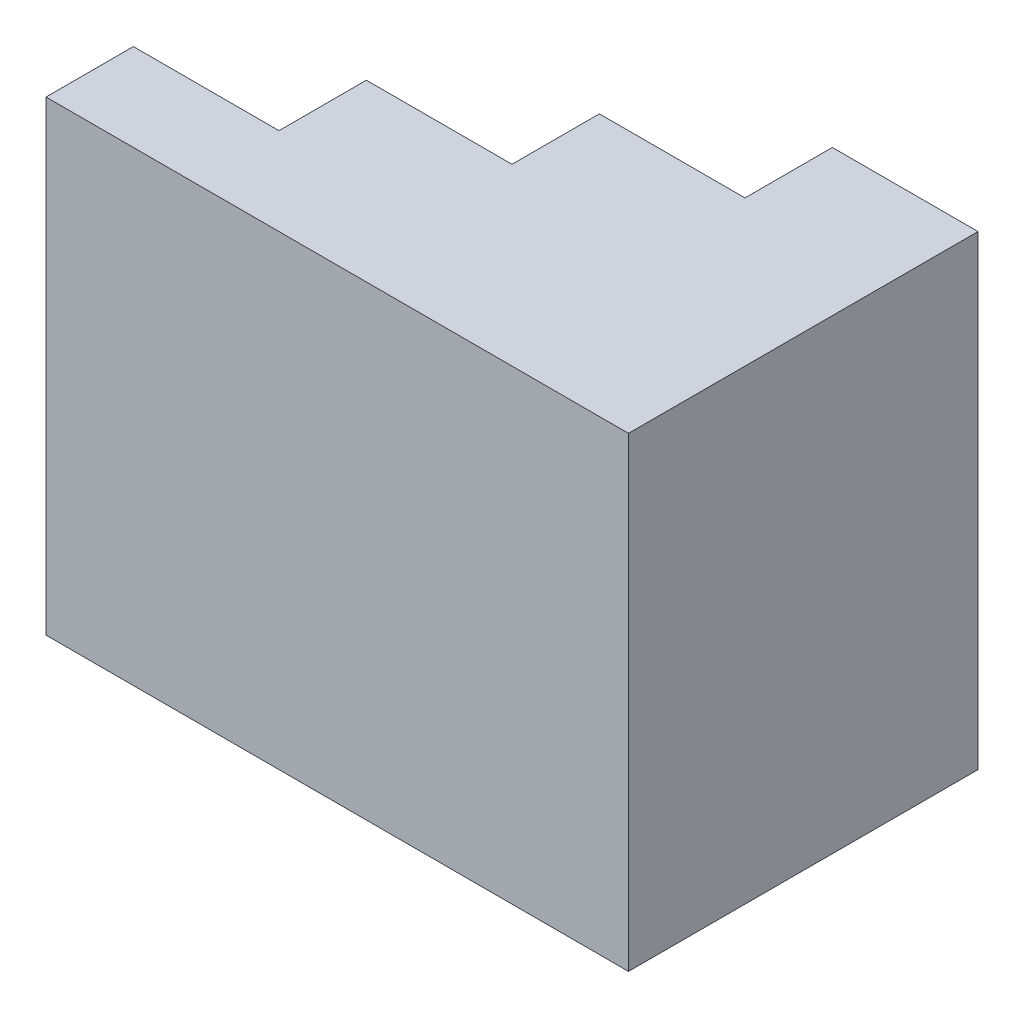
ISO-10303-21;
HEADER;
FILE_DESCRIPTION(('STEP AP214'),'2;1');
FILE_NAME('part.step','',(''),(''),'','','');
FILE_SCHEMA(('AUTOMOTIVE_DESIGN { 1 0 10303 214 1 1 1 1 }'));
ENDSEC;
DATA;
#1=APPLICATION_CONTEXT('core data for automotive mechanical design processes');
#2=APPLICATION_PROTOCOL_DEFINITION('international standard','automotive_design',2000,#1);
#3=PRODUCT_CONTEXT('',#1,'mechanical');
#4=PRODUCT('Part','Part','',(#3));
#5=PRODUCT_RELATED_PRODUCT_CATEGORY('part','',(#4));
#6=PRODUCT_DEFINITION_FORMATION('','',#4);
#7=PRODUCT_DEFINITION_CONTEXT('part definition',#1,'design');
#8=PRODUCT_DEFINITION('design','',#6,#7);
#9=PRODUCT_DEFINITION_SHAPE('','',#8);
#10=(LENGTH_UNIT() NAMED_UNIT(*) SI_UNIT(.MILLI.,.METRE.));
#11=(NAMED_UNIT(*) PLANE_ANGLE_UNIT() SI_UNIT($,.RADIAN.));
#12=(NAMED_UNIT(*) SI_UNIT($,.STERADIAN.) SOLID_ANGLE_UNIT());
#13=UNCERTAINTY_MEASURE_WITH_UNIT(LENGTH_MEASURE(1.E-05),#10,'distance_accuracy_value','');
#14=(GEOMETRIC_REPRESENTATION_CONTEXT(3) GLOBAL_UNCERTAINTY_ASSIGNED_CONTEXT((#13)) GLOBAL_UNIT_ASSIGNED_CONTEXT((#10,
#11,#12)) REPRESENTATION_CONTEXT('',''));
#15=CARTESIAN_POINT('',(0.,0.,0.));
#16=DIRECTION('',(0.,0.,1.));
#17=DIRECTION('',(1.,0.,0.));
#18=AXIS2_PLACEMENT_3D('',#15,#16,#17);
#19=CARTESIAN_POINT('',(0.,0.,60.));
#20=DIRECTION('',(0.,1.,0.));
#21=DIRECTION('',(0.,0.,1.));
#22=AXIS2_PLACEMENT_3D('',#19,#20,#21);
#23=PLANE('',#22);
#24=DIRECTION('',(1.,0.,0.));
#25=VECTOR('',#24,1.);
#26=CARTESIAN_POINT('',(0.,0.,0.));
#27=LINE('',#26,#25);
#28=CARTESIAN_POINT('',(0.,0.,0.));
#29=VERTEX_POINT('',#28);
#30=CARTESIAN_POINT('',(100.,0.,0.));
#31=VERTEX_POINT('',#30);
#32=EDGE_CURVE('E183',#29,#31,#27,.T.);
#33=ORIENTED_EDGE('',*,*,#32,.T.);
#34=DIRECTION('',(0.,0.,-1.));
#35=VECTOR('',#34,1.);
#36=CARTESIAN_POINT('',(100.,0.,60.));
#37=LINE('',#36,#35);
#38=CARTESIAN_POINT('',(100.,0.,60.));
#39=VERTEX_POINT('',#38);
#40=EDGE_CURVE('E11',#39,#31,#37,.T.);
#41=ORIENTED_EDGE('',*,*,#40,.F.);
#42=DIRECTION('',(1.,0.,0.));
#43=VECTOR('',#42,1.);
#44=CARTESIAN_POINT('',(0.,0.,60.));
#45=LINE('',#44,#43);
#46=CARTESIAN_POINT('',(0.,0.,60.));
#47=VERTEX_POINT('',#46);
#48=EDGE_CURVE('E170',#47,#39,#45,.T.);
#49=ORIENTED_EDGE('',*,*,#48,.F.);
#50=DIRECTION('',(0.,0.,-1.));
#51=VECTOR('',#50,1.);
#52=CARTESIAN_POINT('',(0.,0.,60.));
#53=LINE('',#52,#51);
#54=EDGE_CURVE('E69',#47,#29,#53,.T.);
#55=ORIENTED_EDGE('',*,*,#54,.T.);
#56=EDGE_LOOP('',(#33,#41,#49,#55));
#57=FACE_BOUND('',#56,.T.);
#58=ADVANCED_FACE('F45',(#57),#23,.F.);
#59=CARTESIAN_POINT('',(100.,0.,60.));
#60=DIRECTION('',(-1.,0.,0.));
#61=DIRECTION('',(0.,0.,1.));
#62=AXIS2_PLACEMENT_3D('',#59,#60,#61);
#63=PLANE('',#62);
#64=DIRECTION('',(0.,1.,0.));
#65=VECTOR('',#64,1.);
#66=CARTESIAN_POINT('',(100.,0.,0.));
#67=LINE('',#66,#65);
#68=CARTESIAN_POINT('',(100.,80.,0.));
#69=VERTEX_POINT('',#68);
#70=EDGE_CURVE('E186',#31,#69,#67,.T.);
#71=ORIENTED_EDGE('',*,*,#70,.T.);
#72=DIRECTION('',(0.,0.,-1.));
#73=VECTOR('',#72,1.);
#74=CARTESIAN_POINT('',(100.,80.,60.));
#75=LINE('',#74,#73);
#76=CARTESIAN_POINT('',(100.,80.,60.));
#77=VERTEX_POINT('',#76);
#78=EDGE_CURVE('E53',#77,#69,#75,.T.);
#79=ORIENTED_EDGE('',*,*,#78,.F.);
#80=DIRECTION('',(0.,1.,0.));
#81=VECTOR('',#80,1.);
#82=CARTESIAN_POINT('',(100.,0.,60.));
#83=LINE('',#82,#81);
#84=EDGE_CURVE('E92',#39,#77,#83,.T.);
#85=ORIENTED_EDGE('',*,*,#84,.F.);
#86=ORIENTED_EDGE('',*,*,#40,.T.);
#87=EDGE_LOOP('',(#71,#79,#85,#86));
#88=FACE_BOUND('',#87,.T.);
#89=ADVANCED_FACE('F206',(#88),#63,.F.);
#90=CARTESIAN_POINT('',(0.,80.,60.));
#91=DIRECTION('',(0.,1.,0.));
#92=DIRECTION('',(0.,0.,1.));
#93=AXIS2_PLACEMENT_3D('',#90,#91,#92);
#94=PLANE('',#93);
#95=DIRECTION('',(0.,0.,-1.));
#96=VECTOR('',#95,1.);
#97=CARTESIAN_POINT('',(75.,80.,0.));
#98=LINE('',#97,#96);
#99=CARTESIAN_POINT('',(75.,80.,15.));
#100=VERTEX_POINT('',#99);
#101=CARTESIAN_POINT('',(75.,80.,0.));
#102=VERTEX_POINT('',#101);
#103=EDGE_CURVE('E156',#100,#102,#98,.T.);
#104=ORIENTED_EDGE('',*,*,#103,.F.);
#105=DIRECTION('',(1.,0.,0.));
#106=VECTOR('',#105,1.);
#107=CARTESIAN_POINT('',(75.,80.,15.));
#108=LINE('',#107,#106);
#109=CARTESIAN_POINT('',(50.,80.,15.));
#110=VERTEX_POINT('',#109);
#111=EDGE_CURVE('E249',#110,#100,#108,.T.);
#112=ORIENTED_EDGE('',*,*,#111,.F.);
#113=DIRECTION('',(0.,0.,-1.));
#114=VECTOR('',#113,1.);
#115=CARTESIAN_POINT('',(50.,80.,15.));
#116=LINE('',#115,#114);
#117=CARTESIAN_POINT('',(50.,80.,30.));
#118=VERTEX_POINT('',#117);
#119=EDGE_CURVE('E245',#118,#110,#116,.T.);
#120=ORIENTED_EDGE('',*,*,#119,.F.);
#121=DIRECTION('',(1.,0.,0.));
#122=VECTOR('',#121,1.);
#123=CARTESIAN_POINT('',(50.,80.,30.));
#124=LINE('',#123,#122);
#125=CARTESIAN_POINT('',(25.,80.,30.));
#126=VERTEX_POINT('',#125);
#127=EDGE_CURVE('E232',#126,#118,#124,.T.);
#128=ORIENTED_EDGE('',*,*,#127,.F.);
#129=DIRECTION('',(0.,0.,-1.));
#130=VECTOR('',#129,1.);
#131=CARTESIAN_POINT('',(25.,80.,30.));
#132=LINE('',#131,#130);
#133=CARTESIAN_POINT('',(25.,80.,45.));
#134=VERTEX_POINT('',#133);
#135=EDGE_CURVE('E238',#134,#126,#132,.T.);
#136=ORIENTED_EDGE('',*,*,#135,.F.);
#137=DIRECTION('',(1.,0.,0.));
#138=VECTOR('',#137,1.);
#139=CARTESIAN_POINT('',(25.,80.,45.));
#140=LINE('',#139,#138);
#141=CARTESIAN_POINT('',(0.,80.,45.));
#142=VERTEX_POINT('',#141);
#143=EDGE_CURVE('E241',#142,#134,#140,.T.);
#144=ORIENTED_EDGE('',*,*,#143,.F.);
#145=DIRECTION('',(0.,0.,-1.));
#146=VECTOR('',#145,1.);
#147=CARTESIAN_POINT('',(0.,80.,60.));
#148=LINE('',#147,#146);
#149=CARTESIAN_POINT('',(0.,80.,60.));
#150=VERTEX_POINT('',#149);
#151=EDGE_CURVE('E160',#150,#142,#148,.T.);
#152=ORIENTED_EDGE('',*,*,#151,.F.);
#153=DIRECTION('',(1.,0.,0.));
#154=VECTOR('',#153,1.);
#155=CARTESIAN_POINT('',(0.,80.,60.));
#156=LINE('',#155,#154);
#157=EDGE_CURVE('E176',#150,#77,#156,.T.);
#158=ORIENTED_EDGE('',*,*,#157,.T.);
#159=ORIENTED_EDGE('',*,*,#78,.T.);
#160=DIRECTION('',(1.,0.,0.));
#161=VECTOR('',#160,1.);
#162=CARTESIAN_POINT('',(0.,80.,0.));
#163=LINE('',#162,#161);
#164=EDGE_CURVE('E191',#102,#69,#163,.T.);
#165=ORIENTED_EDGE('',*,*,#164,.F.);
#166=EDGE_LOOP('',(#104,#112,#120,#128,#136,#144,#152,#158,#159,#165));
#167=FACE_BOUND('',#166,.T.);
#168=ADVANCED_FACE('F204',(#167),#94,.T.);
#169=CARTESIAN_POINT('',(0.,0.,60.));
#170=DIRECTION('',(-1.,0.,0.));
#171=DIRECTION('',(0.,0.,1.));
#172=AXIS2_PLACEMENT_3D('',#169,#170,#171);
#173=PLANE('',#172);
#174=DIRECTION('',(0.,1.,0.));
#175=VECTOR('',#174,1.);
#176=CARTESIAN_POINT('',(0.,20.,45.));
#177=LINE('',#176,#175);
#178=CARTESIAN_POINT('',(0.,20.,45.));
#179=VERTEX_POINT('',#178);
#180=EDGE_CURVE('E141',#179,#142,#177,.T.);
#181=ORIENTED_EDGE('',*,*,#180,.F.);
#182=DIRECTION('',(0.,0.,1.));
#183=VECTOR('',#182,1.);
#184=CARTESIAN_POINT('',(0.,20.,45.));
#185=LINE('',#184,#183);
#186=CARTESIAN_POINT('',(0.,20.,0.));
#187=VERTEX_POINT('',#186);
#188=EDGE_CURVE('E148',#187,#179,#185,.T.);
#189=ORIENTED_EDGE('',*,*,#188,.F.);
#190=DIRECTION('',(0.,1.,0.));
#191=VECTOR('',#190,1.);
#192=CARTESIAN_POINT('',(0.,0.,0.));
#193=LINE('',#192,#191);
#194=EDGE_CURVE('E173',#29,#187,#193,.T.);
#195=ORIENTED_EDGE('',*,*,#194,.F.);
#196=ORIENTED_EDGE('',*,*,#54,.F.);
#197=DIRECTION('',(0.,1.,0.));
#198=VECTOR('',#197,1.);
#199=CARTESIAN_POINT('',(0.,0.,60.));
#200=LINE('',#199,#198);
#201=EDGE_CURVE('E180',#47,#150,#200,.T.);
#202=ORIENTED_EDGE('',*,*,#201,.T.);
#203=ORIENTED_EDGE('',*,*,#151,.T.);
#204=EDGE_LOOP('',(#181,#189,#195,#196,#202,#203));
#205=FACE_BOUND('',#204,.T.);
#206=ADVANCED_FACE('F159',(#205),#173,.T.);
#207=CARTESIAN_POINT('',(0.,0.,60.));
#208=DIRECTION('',(0.,0.,1.));
#209=DIRECTION('',(1.,0.,0.));
#210=AXIS2_PLACEMENT_3D('',#207,#208,#209);
#211=PLANE('',#210);
#212=ORIENTED_EDGE('',*,*,#48,.T.);
#213=ORIENTED_EDGE('',*,*,#84,.T.);
#214=ORIENTED_EDGE('',*,*,#157,.F.);
#215=ORIENTED_EDGE('',*,*,#201,.F.);
#216=EDGE_LOOP('',(#212,#213,#214,#215));
#217=FACE_BOUND('',#216,.T.);
#218=ADVANCED_FACE('F276',(#217),#211,.T.);
#219=CARTESIAN_POINT('',(0.,0.,0.));
#220=DIRECTION('',(0.,0.,1.));
#221=DIRECTION('',(1.,0.,0.));
#222=AXIS2_PLACEMENT_3D('',#219,#220,#221);
#223=PLANE('',#222);
#224=DIRECTION('',(-1.,0.,0.));
#225=VECTOR('',#224,1.);
#226=CARTESIAN_POINT('',(0.,20.,0.));
#227=LINE('',#226,#225);
#228=CARTESIAN_POINT('',(75.,20.,0.));
#229=VERTEX_POINT('',#228);
#230=EDGE_CURVE('E153',#229,#187,#227,.T.);
#231=ORIENTED_EDGE('',*,*,#230,.F.);
#232=DIRECTION('',(0.,1.,0.));
#233=VECTOR('',#232,1.);
#234=CARTESIAN_POINT('',(75.,20.,0.));
#235=LINE('',#234,#233);
#236=EDGE_CURVE('E187',#229,#102,#235,.T.);
#237=ORIENTED_EDGE('',*,*,#236,.T.);
#238=ORIENTED_EDGE('',*,*,#164,.T.);
#239=ORIENTED_EDGE('',*,*,#70,.F.);
#240=ORIENTED_EDGE('',*,*,#32,.F.);
#241=ORIENTED_EDGE('',*,*,#194,.T.);
#242=EDGE_LOOP('',(#231,#237,#238,#239,#240,#241));
#243=FACE_BOUND('',#242,.T.);
#244=ADVANCED_FACE('F209',(#243),#223,.F.);
#245=CARTESIAN_POINT('',(75.,20.,0.));
#246=DIRECTION('',(1.,0.,0.));
#247=DIRECTION('',(0.,0.,-1.));
#248=AXIS2_PLACEMENT_3D('',#245,#246,#247);
#249=PLANE('',#248);
#250=ORIENTED_EDGE('',*,*,#103,.T.);
#251=ORIENTED_EDGE('',*,*,#236,.F.);
#252=DIRECTION('',(0.,0.,-1.));
#253=VECTOR('',#252,1.);
#254=CARTESIAN_POINT('',(75.,20.,0.));
#255=LINE('',#254,#253);
#256=CARTESIAN_POINT('',(75.,20.,15.));
#257=VERTEX_POINT('',#256);
#258=EDGE_CURVE('E60',#257,#229,#255,.T.);
#259=ORIENTED_EDGE('',*,*,#258,.F.);
#260=DIRECTION('',(0.,1.,0.));
#261=VECTOR('',#260,1.);
#262=CARTESIAN_POINT('',(75.,20.,15.));
#263=LINE('',#262,#261);
#264=EDGE_CURVE('E213',#257,#100,#263,.T.);
#265=ORIENTED_EDGE('',*,*,#264,.T.);
#266=EDGE_LOOP('',(#250,#251,#259,#265));
#267=FACE_BOUND('',#266,.T.);
#268=ADVANCED_FACE('F256',(#267),#249,.F.);
#269=CARTESIAN_POINT('',(75.,20.,15.));
#270=DIRECTION('',(0.,0.,1.));
#271=DIRECTION('',(1.,0.,0.));
#272=AXIS2_PLACEMENT_3D('',#269,#270,#271);
#273=PLANE('',#272);
#274=ORIENTED_EDGE('',*,*,#111,.T.);
#275=ORIENTED_EDGE('',*,*,#264,.F.);
#276=DIRECTION('',(1.,0.,0.));
#277=VECTOR('',#276,1.);
#278=CARTESIAN_POINT('',(75.,20.,15.));
#279=LINE('',#278,#277);
#280=CARTESIAN_POINT('',(50.,20.,15.));
#281=VERTEX_POINT('',#280);
#282=EDGE_CURVE('E259',#281,#257,#279,.T.);
#283=ORIENTED_EDGE('',*,*,#282,.F.);
#284=DIRECTION('',(0.,1.,0.));
#285=VECTOR('',#284,1.);
#286=CARTESIAN_POINT('',(50.,20.,15.));
#287=LINE('',#286,#285);
#288=EDGE_CURVE('E216',#281,#110,#287,.T.);
#289=ORIENTED_EDGE('',*,*,#288,.T.);
#290=EDGE_LOOP('',(#274,#275,#283,#289));
#291=FACE_BOUND('',#290,.T.);
#292=ADVANCED_FACE('F258',(#291),#273,.F.);
#293=CARTESIAN_POINT('',(50.,20.,15.));
#294=DIRECTION('',(1.,0.,0.));
#295=DIRECTION('',(0.,0.,-1.));
#296=AXIS2_PLACEMENT_3D('',#293,#294,#295);
#297=PLANE('',#296);
#298=ORIENTED_EDGE('',*,*,#119,.T.);
#299=ORIENTED_EDGE('',*,*,#288,.F.);
#300=DIRECTION('',(0.,0.,-1.));
#301=VECTOR('',#300,1.);
#302=CARTESIAN_POINT('',(50.,20.,15.));
#303=LINE('',#302,#301);
#304=CARTESIAN_POINT('',(50.,20.,30.));
#305=VERTEX_POINT('',#304);
#306=EDGE_CURVE('E262',#305,#281,#303,.T.);
#307=ORIENTED_EDGE('',*,*,#306,.F.);
#308=DIRECTION('',(0.,1.,0.));
#309=VECTOR('',#308,1.);
#310=CARTESIAN_POINT('',(50.,20.,30.));
#311=LINE('',#310,#309);
#312=EDGE_CURVE('E223',#305,#118,#311,.T.);
#313=ORIENTED_EDGE('',*,*,#312,.T.);
#314=EDGE_LOOP('',(#298,#299,#307,#313));
#315=FACE_BOUND('',#314,.T.);
#316=ADVANCED_FACE('F298',(#315),#297,.F.);
#317=CARTESIAN_POINT('',(50.,20.,30.));
#318=DIRECTION('',(0.,0.,1.));
#319=DIRECTION('',(1.,0.,0.));
#320=AXIS2_PLACEMENT_3D('',#317,#318,#319);
#321=PLANE('',#320);
#322=ORIENTED_EDGE('',*,*,#127,.T.);
#323=ORIENTED_EDGE('',*,*,#312,.F.);
#324=DIRECTION('',(1.,0.,0.));
#325=VECTOR('',#324,1.);
#326=CARTESIAN_POINT('',(50.,20.,30.));
#327=LINE('',#326,#325);
#328=CARTESIAN_POINT('',(25.,20.,30.));
#329=VERTEX_POINT('',#328);
#330=EDGE_CURVE('E235',#329,#305,#327,.T.);
#331=ORIENTED_EDGE('',*,*,#330,.F.);
#332=DIRECTION('',(0.,1.,0.));
#333=VECTOR('',#332,1.);
#334=CARTESIAN_POINT('',(25.,20.,30.));
#335=LINE('',#334,#333);
#336=EDGE_CURVE('E165',#329,#126,#335,.T.);
#337=ORIENTED_EDGE('',*,*,#336,.T.);
#338=EDGE_LOOP('',(#322,#323,#331,#337));
#339=FACE_BOUND('',#338,.T.);
#340=ADVANCED_FACE('F230',(#339),#321,.F.);
#341=CARTESIAN_POINT('',(25.,20.,30.));
#342=DIRECTION('',(1.,0.,0.));
#343=DIRECTION('',(0.,0.,-1.));
#344=AXIS2_PLACEMENT_3D('',#341,#342,#343);
#345=PLANE('',#344);
#346=ORIENTED_EDGE('',*,*,#135,.T.);
#347=ORIENTED_EDGE('',*,*,#336,.F.);
#348=DIRECTION('',(0.,0.,-1.));
#349=VECTOR('',#348,1.);
#350=CARTESIAN_POINT('',(25.,20.,30.));
#351=LINE('',#350,#349);
#352=CARTESIAN_POINT('',(25.,20.,45.));
#353=VERTEX_POINT('',#352);
#354=EDGE_CURVE('E147',#353,#329,#351,.T.);
#355=ORIENTED_EDGE('',*,*,#354,.F.);
#356=DIRECTION('',(0.,1.,0.));
#357=VECTOR('',#356,1.);
#358=CARTESIAN_POINT('',(25.,20.,45.));
#359=LINE('',#358,#357);
#360=EDGE_CURVE('E143',#353,#134,#359,.T.);
#361=ORIENTED_EDGE('',*,*,#360,.T.);
#362=EDGE_LOOP('',(#346,#347,#355,#361));
#363=FACE_BOUND('',#362,.T.);
#364=ADVANCED_FACE('F239',(#363),#345,.F.);
#365=CARTESIAN_POINT('',(25.,20.,45.));
#366=DIRECTION('',(0.,0.,1.));
#367=DIRECTION('',(1.,0.,0.));
#368=AXIS2_PLACEMENT_3D('',#365,#366,#367);
#369=PLANE('',#368);
#370=ORIENTED_EDGE('',*,*,#143,.T.);
#371=ORIENTED_EDGE('',*,*,#360,.F.);
#372=DIRECTION('',(1.,0.,0.));
#373=VECTOR('',#372,1.);
#374=CARTESIAN_POINT('',(25.,20.,45.));
#375=LINE('',#374,#373);
#376=EDGE_CURVE('E136',#179,#353,#375,.T.);
#377=ORIENTED_EDGE('',*,*,#376,.F.);
#378=ORIENTED_EDGE('',*,*,#180,.T.);
#379=EDGE_LOOP('',(#370,#371,#377,#378));
#380=FACE_BOUND('',#379,.T.);
#381=ADVANCED_FACE('F139',(#380),#369,.F.);
#382=CARTESIAN_POINT('',(0.,20.,0.));
#383=DIRECTION('',(0.,-1.,0.));
#384=DIRECTION('',(0.,0.,-1.));
#385=AXIS2_PLACEMENT_3D('',#382,#383,#384);
#386=PLANE('',#385);
#387=ORIENTED_EDGE('',*,*,#188,.T.);
#388=ORIENTED_EDGE('',*,*,#376,.T.);
#389=ORIENTED_EDGE('',*,*,#354,.T.);
#390=ORIENTED_EDGE('',*,*,#330,.T.);
#391=ORIENTED_EDGE('',*,*,#306,.T.);
#392=ORIENTED_EDGE('',*,*,#282,.T.);
#393=ORIENTED_EDGE('',*,*,#258,.T.);
#394=ORIENTED_EDGE('',*,*,#230,.T.);
#395=EDGE_LOOP('',(#387,#388,#389,#390,#391,#392,#393,#394));
#396=FACE_BOUND('',#395,.T.);
#397=ADVANCED_FACE('F151',(#396),#386,.F.);
#398=CLOSED_SHELL('',(#58,#89,#168,#206,#218,#244,#268,#292,#316,#340,#364,#381,#397));
#399=MANIFOLD_SOLID_BREP('B2',#398);
#400=ADVANCED_BREP_SHAPE_REPRESENTATION('',(#18,#399),#14);
#401=SHAPE_DEFINITION_REPRESENTATION(#9,#400);
ENDSEC;
END-ISO-10303-21;
